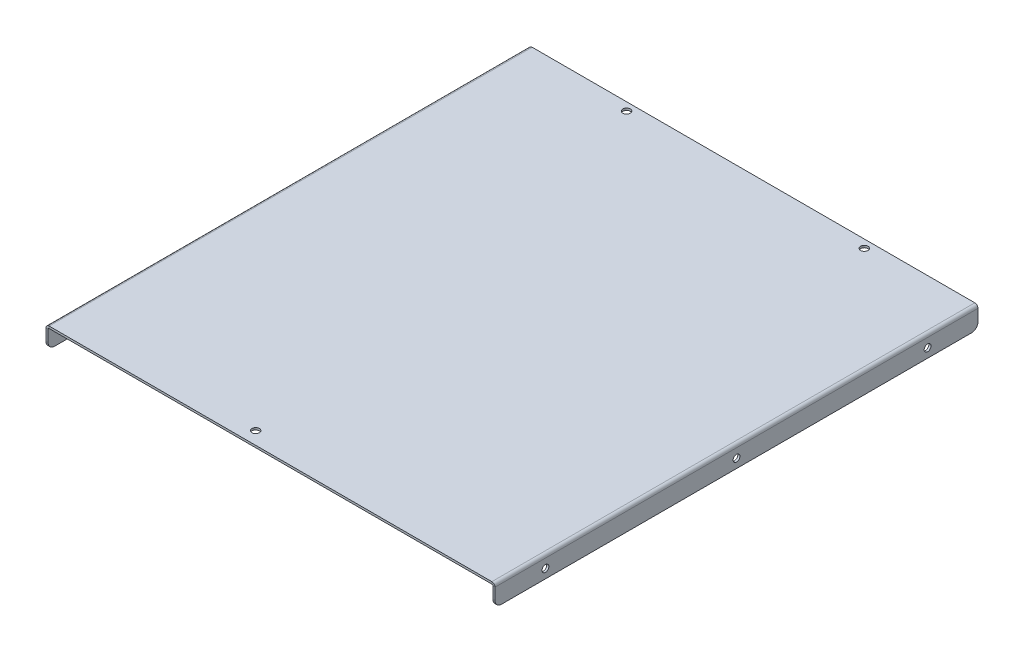
ISO-10303-21;
HEADER;
FILE_DESCRIPTION(('STEP AP214'),'2;1');
FILE_NAME('part.step','',(''),(''),'','','');
FILE_SCHEMA(('AUTOMOTIVE_DESIGN { 1 0 10303 214 1 1 1 1 }'));
ENDSEC;
DATA;
#1=APPLICATION_CONTEXT('core data for automotive mechanical design processes');
#2=APPLICATION_PROTOCOL_DEFINITION('international standard','automotive_design',2000,#1);
#3=PRODUCT_CONTEXT('',#1,'mechanical');
#4=PRODUCT('Part','Part','',(#3));
#5=PRODUCT_RELATED_PRODUCT_CATEGORY('part','',(#4));
#6=PRODUCT_DEFINITION_FORMATION('','',#4);
#7=PRODUCT_DEFINITION_CONTEXT('part definition',#1,'design');
#8=PRODUCT_DEFINITION('design','',#6,#7);
#9=PRODUCT_DEFINITION_SHAPE('','',#8);
#10=(LENGTH_UNIT() NAMED_UNIT(*) SI_UNIT(.MILLI.,.METRE.));
#11=(NAMED_UNIT(*) PLANE_ANGLE_UNIT() SI_UNIT($,.RADIAN.));
#12=(NAMED_UNIT(*) SI_UNIT($,.STERADIAN.) SOLID_ANGLE_UNIT());
#13=UNCERTAINTY_MEASURE_WITH_UNIT(LENGTH_MEASURE(1.E-05),#10,'distance_accuracy_value','');
#14=(GEOMETRIC_REPRESENTATION_CONTEXT(3) GLOBAL_UNCERTAINTY_ASSIGNED_CONTEXT((#13)) GLOBAL_UNIT_ASSIGNED_CONTEXT((#10,
#11,#12)) REPRESENTATION_CONTEXT('',''));
#15=CARTESIAN_POINT('',(0.,0.,0.));
#16=DIRECTION('',(0.,0.,1.));
#17=DIRECTION('',(1.,0.,0.));
#18=AXIS2_PLACEMENT_3D('',#15,#16,#17);
#19=CARTESIAN_POINT('',(0.,-1.,0.));
#20=DIRECTION('',(0.,1.,0.));
#21=DIRECTION('',(0.,0.,1.));
#22=AXIS2_PLACEMENT_3D('',#19,#20,#21);
#23=PLANE('',#22);
#24=CARTESIAN_POINT('',(-13.,-1.,107.75));
#25=DIRECTION('',(0.,1.,0.));
#26=DIRECTION('',(0.,0.,1.));
#27=AXIS2_PLACEMENT_3D('',#24,#25,#26);
#28=CIRCLE('',#27,1.75);
#29=CARTESIAN_POINT('',(-13.,-1.,109.5));
#30=VERTEX_POINT('',#29);
#31=EDGE_CURVE('E911',#30,#30,#28,.T.);
#32=ORIENTED_EDGE('',*,*,#31,.T.);
#33=EDGE_LOOP('',(#32));
#34=FACE_BOUND('',#33,.T.);
#35=CARTESIAN_POINT('',(-55.9999999999999,-1.,-109.950000000001));
#36=DIRECTION('',(0.,1.,0.));
#37=DIRECTION('',(0.,0.,1.));
#38=AXIS2_PLACEMENT_3D('',#35,#36,#37);
#39=CIRCLE('',#38,1.75);
#40=CARTESIAN_POINT('',(-55.9999999999999,-1.,-108.200000000001));
#41=VERTEX_POINT('',#40);
#42=EDGE_CURVE('E928',#41,#41,#39,.T.);
#43=ORIENTED_EDGE('',*,*,#42,.T.);
#44=EDGE_LOOP('',(#43));
#45=FACE_BOUND('',#44,.T.);
#46=CARTESIAN_POINT('',(56.0000000000001,-1.,-109.950000000001));
#47=DIRECTION('',(0.,1.,0.));
#48=DIRECTION('',(0.,0.,1.));
#49=AXIS2_PLACEMENT_3D('',#46,#47,#48);
#50=CIRCLE('',#49,1.75);
#51=CARTESIAN_POINT('',(56.0000000000001,-1.,-108.200000000001));
#52=VERTEX_POINT('',#51);
#53=EDGE_CURVE('E923',#52,#52,#50,.T.);
#54=ORIENTED_EDGE('',*,*,#53,.T.);
#55=EDGE_LOOP('',(#54));
#56=FACE_BOUND('',#55,.T.);
#57=DIRECTION('',(0.,0.,-1.));
#58=VECTOR('',#57,1.);
#59=CARTESIAN_POINT('',(-104.25,-1.00000000000001,-113.75));
#60=LINE('',#59,#58);
#61=CARTESIAN_POINT('',(-104.25,-1.00000000000001,-113.75));
#62=VERTEX_POINT('',#61);
#63=CARTESIAN_POINT('',(-104.25,-1.00000000000001,113.75));
#64=VERTEX_POINT('',#63);
#65=EDGE_CURVE('E295',#62,#64,#60,.F.);
#66=ORIENTED_EDGE('',*,*,#65,.F.);
#67=DIRECTION('',(-1.,0.,0.));
#68=VECTOR('',#67,1.);
#69=CARTESIAN_POINT('',(-105.75,-1.,-113.75));
#70=LINE('',#69,#68);
#71=CARTESIAN_POINT('',(104.25,-1.00000000000001,-113.75));
#72=VERTEX_POINT('',#71);
#73=EDGE_CURVE('E375',#72,#62,#70,.T.);
#74=ORIENTED_EDGE('',*,*,#73,.F.);
#75=DIRECTION('',(0.,0.,1.));
#76=VECTOR('',#75,1.);
#77=CARTESIAN_POINT('',(104.25,-1.00000000000001,113.75));
#78=LINE('',#77,#76);
#79=CARTESIAN_POINT('',(104.25,-1.00000000000001,113.75));
#80=VERTEX_POINT('',#79);
#81=EDGE_CURVE('E361',#80,#72,#78,.F.);
#82=ORIENTED_EDGE('',*,*,#81,.F.);
#83=DIRECTION('',(1.,0.,0.));
#84=VECTOR('',#83,1.);
#85=CARTESIAN_POINT('',(-105.75,-1.,113.75));
#86=LINE('',#85,#84);
#87=EDGE_CURVE('E379',#64,#80,#86,.T.);
#88=ORIENTED_EDGE('',*,*,#87,.F.);
#89=EDGE_LOOP('',(#66,#74,#82,#88));
#90=FACE_BOUND('',#89,.T.);
#91=ADVANCED_FACE('F87',(#34,#45,#56,#90),#23,.F.);
#92=CARTESIAN_POINT('',(0.,0.,0.));
#93=DIRECTION('',(0.,1.,0.));
#94=DIRECTION('',(0.,0.,1.));
#95=AXIS2_PLACEMENT_3D('',#92,#93,#94);
#96=PLANE('',#95);
#97=CARTESIAN_POINT('',(-13.,0.,107.75));
#98=DIRECTION('',(0.,1.,0.));
#99=DIRECTION('',(0.,0.,1.));
#100=AXIS2_PLACEMENT_3D('',#97,#98,#99);
#101=CIRCLE('',#100,1.75);
#102=CARTESIAN_POINT('',(-13.,0.,109.5));
#103=VERTEX_POINT('',#102);
#104=EDGE_CURVE('E909',#103,#103,#101,.T.);
#105=ORIENTED_EDGE('',*,*,#104,.F.);
#106=EDGE_LOOP('',(#105));
#107=FACE_BOUND('',#106,.T.);
#108=CARTESIAN_POINT('',(-55.9999999999999,0.,-109.950000000001));
#109=DIRECTION('',(0.,1.,0.));
#110=DIRECTION('',(0.,0.,1.));
#111=AXIS2_PLACEMENT_3D('',#108,#109,#110);
#112=CIRCLE('',#111,1.75);
#113=CARTESIAN_POINT('',(-55.9999999999999,0.,-108.200000000001));
#114=VERTEX_POINT('',#113);
#115=EDGE_CURVE('E917',#114,#114,#112,.T.);
#116=ORIENTED_EDGE('',*,*,#115,.F.);
#117=EDGE_LOOP('',(#116));
#118=FACE_BOUND('',#117,.T.);
#119=CARTESIAN_POINT('',(56.0000000000001,0.,-109.950000000001));
#120=DIRECTION('',(0.,1.,0.));
#121=DIRECTION('',(0.,0.,1.));
#122=AXIS2_PLACEMENT_3D('',#119,#120,#121);
#123=CIRCLE('',#122,1.75);
#124=CARTESIAN_POINT('',(56.0000000000001,0.,-108.200000000001));
#125=VERTEX_POINT('',#124);
#126=EDGE_CURVE('E913',#125,#125,#123,.T.);
#127=ORIENTED_EDGE('',*,*,#126,.F.);
#128=EDGE_LOOP('',(#127));
#129=FACE_BOUND('',#128,.T.);
#130=DIRECTION('',(-1.,0.,0.));
#131=VECTOR('',#130,1.);
#132=CARTESIAN_POINT('',(-105.75,0.,-113.75));
#133=LINE('',#132,#131);
#134=CARTESIAN_POINT('',(104.25,0.,-113.75));
#135=VERTEX_POINT('',#134);
#136=CARTESIAN_POINT('',(-104.25,0.,-113.75));
#137=VERTEX_POINT('',#136);
#138=EDGE_CURVE('E371',#135,#137,#133,.T.);
#139=ORIENTED_EDGE('',*,*,#138,.T.);
#140=DIRECTION('',(0.,0.,-1.));
#141=VECTOR('',#140,1.);
#142=CARTESIAN_POINT('',(-104.25,0.,-113.75));
#143=LINE('',#142,#141);
#144=CARTESIAN_POINT('',(-104.25,0.,113.75));
#145=VERTEX_POINT('',#144);
#146=EDGE_CURVE('E238',#137,#145,#143,.F.);
#147=ORIENTED_EDGE('',*,*,#146,.T.);
#148=DIRECTION('',(1.,0.,0.));
#149=VECTOR('',#148,1.);
#150=CARTESIAN_POINT('',(-105.75,0.,113.75));
#151=LINE('',#150,#149);
#152=CARTESIAN_POINT('',(104.25,0.,113.75));
#153=VERTEX_POINT('',#152);
#154=EDGE_CURVE('E380',#145,#153,#151,.T.);
#155=ORIENTED_EDGE('',*,*,#154,.T.);
#156=DIRECTION('',(0.,0.,1.));
#157=VECTOR('',#156,1.);
#158=CARTESIAN_POINT('',(104.25,0.,113.75));
#159=LINE('',#158,#157);
#160=EDGE_CURVE('E344',#153,#135,#159,.F.);
#161=ORIENTED_EDGE('',*,*,#160,.T.);
#162=EDGE_LOOP('',(#139,#147,#155,#161));
#163=FACE_BOUND('',#162,.T.);
#164=ADVANCED_FACE('F488',(#107,#118,#129,#163),#96,.T.);
#165=CARTESIAN_POINT('',(-105.75,-1.,-113.75));
#166=DIRECTION('',(0.,0.,-1.));
#167=DIRECTION('',(-1.,0.,0.));
#168=AXIS2_PLACEMENT_3D('',#165,#166,#167);
#169=PLANE('',#168);
#170=ORIENTED_EDGE('',*,*,#73,.T.);
#171=DIRECTION('',(0.,1.,0.));
#172=VECTOR('',#171,1.);
#173=CARTESIAN_POINT('',(-104.25,-1.00000000000001,-113.75));
#174=LINE('',#173,#172);
#175=EDGE_CURVE('E290',#62,#137,#174,.T.);
#176=ORIENTED_EDGE('',*,*,#175,.T.);
#177=ORIENTED_EDGE('',*,*,#138,.F.);
#178=DIRECTION('',(0.,1.,0.));
#179=VECTOR('',#178,1.);
#180=CARTESIAN_POINT('',(104.25,-1.00000000000001,-113.75));
#181=LINE('',#180,#179);
#182=EDGE_CURVE('E367',#72,#135,#181,.T.);
#183=ORIENTED_EDGE('',*,*,#182,.F.);
#184=EDGE_LOOP('',(#170,#176,#177,#183));
#185=FACE_BOUND('',#184,.T.);
#186=ADVANCED_FACE('F486',(#185),#169,.T.);
#187=CARTESIAN_POINT('',(-105.75,-1.,113.75));
#188=DIRECTION('',(0.,0.,1.));
#189=DIRECTION('',(1.,0.,0.));
#190=AXIS2_PLACEMENT_3D('',#187,#188,#189);
#191=PLANE('',#190);
#192=DIRECTION('',(0.,1.,0.));
#193=VECTOR('',#192,1.);
#194=CARTESIAN_POINT('',(-104.25,-1.00000000000001,113.75));
#195=LINE('',#194,#193);
#196=EDGE_CURVE('E300',#64,#145,#195,.T.);
#197=ORIENTED_EDGE('',*,*,#196,.F.);
#198=ORIENTED_EDGE('',*,*,#87,.T.);
#199=DIRECTION('',(0.,1.,0.));
#200=VECTOR('',#199,1.);
#201=CARTESIAN_POINT('',(104.25,-1.00000000000001,113.75));
#202=LINE('',#201,#200);
#203=EDGE_CURVE('E353',#80,#153,#202,.T.);
#204=ORIENTED_EDGE('',*,*,#203,.T.);
#205=ORIENTED_EDGE('',*,*,#154,.F.);
#206=EDGE_LOOP('',(#197,#198,#204,#205));
#207=FACE_BOUND('',#206,.T.);
#208=ADVANCED_FACE('F470',(#207),#191,.T.);
#209=CARTESIAN_POINT('',(104.25,-1.5,-113.75));
#210=DIRECTION('',(0.,0.,-1.));
#211=DIRECTION('',(-1.,0.,0.));
#212=AXIS2_PLACEMENT_3D('',#209,#210,#211);
#213=PLANE('',#212);
#214=DIRECTION('',(-1.,0.,0.));
#215=VECTOR('',#214,1.);
#216=CARTESIAN_POINT('',(105.75,-1.5,-113.75));
#217=LINE('',#216,#215);
#218=CARTESIAN_POINT('',(104.75,-1.49999999999999,-113.75));
#219=VERTEX_POINT('',#218);
#220=CARTESIAN_POINT('',(105.75,-1.49999999999999,-113.75));
#221=VERTEX_POINT('',#220);
#222=EDGE_CURVE('E304',#219,#221,#217,.F.);
#223=ORIENTED_EDGE('',*,*,#222,.F.);
#224=CARTESIAN_POINT('',(104.25,-1.5,-113.75));
#225=DIRECTION('',(0.,0.,1.));
#226=DIRECTION('',(1.,0.,0.));
#227=AXIS2_PLACEMENT_3D('',#224,#225,#226);
#228=CIRCLE('',#227,0.499999999999987);
#229=EDGE_CURVE('E357',#72,#219,#228,.F.);
#230=ORIENTED_EDGE('',*,*,#229,.F.);
#231=ORIENTED_EDGE('',*,*,#182,.T.);
#232=CARTESIAN_POINT('',(104.25,-1.5,-113.75));
#233=DIRECTION('',(0.,0.,1.));
#234=DIRECTION('',(1.,0.,0.));
#235=AXIS2_PLACEMENT_3D('',#232,#233,#234);
#236=CIRCLE('',#235,1.49999999999999);
#237=EDGE_CURVE('E348',#135,#221,#236,.F.);
#238=ORIENTED_EDGE('',*,*,#237,.T.);
#239=EDGE_LOOP('',(#223,#230,#231,#238));
#240=FACE_BOUND('',#239,.T.);
#241=ADVANCED_FACE('F483',(#240),#213,.T.);
#242=CARTESIAN_POINT('',(104.25,-1.5,113.75));
#243=DIRECTION('',(0.,0.,-1.));
#244=DIRECTION('',(-1.,0.,0.));
#245=AXIS2_PLACEMENT_3D('',#242,#243,#244);
#246=PLANE('',#245);
#247=CARTESIAN_POINT('',(104.25,-1.5,113.75));
#248=DIRECTION('',(0.,0.,1.));
#249=DIRECTION('',(1.,0.,0.));
#250=AXIS2_PLACEMENT_3D('',#247,#248,#249);
#251=CIRCLE('',#250,0.499999999999987);
#252=CARTESIAN_POINT('',(104.75,-1.49999999999999,113.75));
#253=VERTEX_POINT('',#252);
#254=EDGE_CURVE('E310',#253,#80,#251,.T.);
#255=ORIENTED_EDGE('',*,*,#254,.F.);
#256=DIRECTION('',(-1.,0.,0.));
#257=VECTOR('',#256,1.);
#258=CARTESIAN_POINT('',(104.75,-1.49999999999999,113.75));
#259=LINE('',#258,#257);
#260=CARTESIAN_POINT('',(105.75,-1.49999999999998,113.75));
#261=VERTEX_POINT('',#260);
#262=EDGE_CURVE('E334',#253,#261,#259,.F.);
#263=ORIENTED_EDGE('',*,*,#262,.T.);
#264=CARTESIAN_POINT('',(104.25,-1.5,113.75));
#265=DIRECTION('',(0.,0.,1.));
#266=DIRECTION('',(1.,0.,0.));
#267=AXIS2_PLACEMENT_3D('',#264,#265,#266);
#268=CIRCLE('',#267,1.49999999999999);
#269=EDGE_CURVE('E349',#261,#153,#268,.T.);
#270=ORIENTED_EDGE('',*,*,#269,.T.);
#271=ORIENTED_EDGE('',*,*,#203,.F.);
#272=EDGE_LOOP('',(#255,#263,#270,#271));
#273=FACE_BOUND('',#272,.T.);
#274=ADVANCED_FACE('F493',(#273),#246,.F.);
#275=CARTESIAN_POINT('',(104.25,-1.5,113.75));
#276=DIRECTION('',(0.,0.,1.));
#277=DIRECTION('',(1.,0.,0.));
#278=AXIS2_PLACEMENT_3D('',#275,#276,#277);
#279=CYLINDRICAL_SURFACE('',#278,1.49999999999999);
#280=ORIENTED_EDGE('',*,*,#160,.F.);
#281=ORIENTED_EDGE('',*,*,#269,.F.);
#282=DIRECTION('',(0.,0.,1.));
#283=VECTOR('',#282,1.);
#284=CARTESIAN_POINT('',(105.75,-1.5,-113.75));
#285=LINE('',#284,#283);
#286=EDGE_CURVE('E330',#261,#221,#285,.F.);
#287=ORIENTED_EDGE('',*,*,#286,.T.);
#288=ORIENTED_EDGE('',*,*,#237,.F.);
#289=EDGE_LOOP('',(#280,#281,#287,#288));
#290=FACE_BOUND('',#289,.T.);
#291=ADVANCED_FACE('F491',(#290),#279,.T.);
#292=CARTESIAN_POINT('',(104.25,-1.5,113.75));
#293=DIRECTION('',(0.,0.,1.));
#294=DIRECTION('',(1.,0.,0.));
#295=AXIS2_PLACEMENT_3D('',#292,#293,#294);
#296=CYLINDRICAL_SURFACE('',#295,0.499999999999987);
#297=ORIENTED_EDGE('',*,*,#81,.T.);
#298=ORIENTED_EDGE('',*,*,#229,.T.);
#299=DIRECTION('',(0.,0.,1.));
#300=VECTOR('',#299,1.);
#301=CARTESIAN_POINT('',(104.75,-1.5,-113.75));
#302=LINE('',#301,#300);
#303=EDGE_CURVE('E338',#219,#253,#302,.T.);
#304=ORIENTED_EDGE('',*,*,#303,.T.);
#305=ORIENTED_EDGE('',*,*,#254,.T.);
#306=EDGE_LOOP('',(#297,#298,#304,#305));
#307=FACE_BOUND('',#306,.T.);
#308=ADVANCED_FACE('F477',(#307),#296,.F.);
#309=CARTESIAN_POINT('',(105.75,-10.,113.75));
#310=DIRECTION('',(0.,0.,-1.));
#311=DIRECTION('',(-1.,0.,0.));
#312=AXIS2_PLACEMENT_3D('',#309,#310,#311);
#313=PLANE('',#312);
#314=DIRECTION('',(0.,1.,0.));
#315=VECTOR('',#314,1.);
#316=CARTESIAN_POINT('',(104.75,-10.,113.75));
#317=LINE('',#316,#315);
#318=CARTESIAN_POINT('',(104.75,-7.00000000000001,113.75));
#319=VERTEX_POINT('',#318);
#320=EDGE_CURVE('E326',#253,#319,#317,.F.);
#321=ORIENTED_EDGE('',*,*,#320,.T.);
#322=DIRECTION('',(-1.,0.,0.));
#323=VECTOR('',#322,1.);
#324=CARTESIAN_POINT('',(105.75,-7.,113.75));
#325=LINE('',#324,#323);
#326=CARTESIAN_POINT('',(105.75,-7.,113.75));
#327=VERTEX_POINT('',#326);
#328=EDGE_CURVE('E422',#319,#327,#325,.F.);
#329=ORIENTED_EDGE('',*,*,#328,.T.);
#330=DIRECTION('',(0.,-1.,0.));
#331=VECTOR('',#330,1.);
#332=CARTESIAN_POINT('',(105.75,3.29619494822483E-13,113.75));
#333=LINE('',#332,#331);
#334=EDGE_CURVE('E315',#261,#327,#333,.T.);
#335=ORIENTED_EDGE('',*,*,#334,.F.);
#336=ORIENTED_EDGE('',*,*,#262,.F.);
#337=EDGE_LOOP('',(#321,#329,#335,#336));
#338=FACE_BOUND('',#337,.T.);
#339=ADVANCED_FACE('F503',(#338),#313,.F.);
#340=CARTESIAN_POINT('',(105.75,-0.999999999999997,-113.75));
#341=DIRECTION('',(0.,0.,1.));
#342=DIRECTION('',(1.,0.,0.));
#343=AXIS2_PLACEMENT_3D('',#340,#341,#342);
#344=PLANE('',#343);
#345=DIRECTION('',(0.,1.,0.));
#346=VECTOR('',#345,1.);
#347=CARTESIAN_POINT('',(105.75,3.29619494822483E-13,-113.75));
#348=LINE('',#347,#346);
#349=CARTESIAN_POINT('',(105.75,-7.,-113.75));
#350=VERTEX_POINT('',#349);
#351=EDGE_CURVE('E307',#350,#221,#348,.T.);
#352=ORIENTED_EDGE('',*,*,#351,.F.);
#353=DIRECTION('',(-1.,0.,0.));
#354=VECTOR('',#353,1.);
#355=CARTESIAN_POINT('',(105.75,-7.,-113.75));
#356=LINE('',#355,#354);
#357=CARTESIAN_POINT('',(104.75,-7.,-113.75));
#358=VERTEX_POINT('',#357);
#359=EDGE_CURVE('E383',#350,#358,#356,.T.);
#360=ORIENTED_EDGE('',*,*,#359,.T.);
#361=DIRECTION('',(0.,-1.,0.));
#362=VECTOR('',#361,1.);
#363=CARTESIAN_POINT('',(104.75,-1.,-113.75));
#364=LINE('',#363,#362);
#365=EDGE_CURVE('E319',#358,#219,#364,.F.);
#366=ORIENTED_EDGE('',*,*,#365,.T.);
#367=ORIENTED_EDGE('',*,*,#222,.T.);
#368=EDGE_LOOP('',(#352,#360,#366,#367));
#369=FACE_BOUND('',#368,.T.);
#370=ADVANCED_FACE('F518',(#369),#344,.F.);
#371=CARTESIAN_POINT('',(105.75,3.29619494822483E-13,0.));
#372=DIRECTION('',(-1.,0.,0.));
#373=DIRECTION('',(0.,-1.,0.));
#374=AXIS2_PLACEMENT_3D('',#371,#372,#373);
#375=PLANE('',#374);
#376=CARTESIAN_POINT('',(105.75,-5.75000000000062,90.));
#377=DIRECTION('',(-1.,0.,0.));
#378=DIRECTION('',(0.,-1.,0.));
#379=AXIS2_PLACEMENT_3D('',#376,#377,#378);
#380=CIRCLE('',#379,1.60000000000001);
#381=CARTESIAN_POINT('',(105.75,-7.35000000000063,90.));
#382=VERTEX_POINT('',#381);
#383=EDGE_CURVE('E394',#382,#382,#380,.T.);
#384=ORIENTED_EDGE('',*,*,#383,.T.);
#385=EDGE_LOOP('',(#384));
#386=FACE_BOUND('',#385,.T.);
#387=CARTESIAN_POINT('',(105.75,-5.75000000000065,0.));
#388=DIRECTION('',(-1.,0.,0.));
#389=DIRECTION('',(0.,-1.,0.));
#390=AXIS2_PLACEMENT_3D('',#387,#388,#389);
#391=CIRCLE('',#390,1.6);
#392=CARTESIAN_POINT('',(105.75,-7.35000000000065,0.));
#393=VERTEX_POINT('',#392);
#394=EDGE_CURVE('E940',#393,#393,#391,.T.);
#395=ORIENTED_EDGE('',*,*,#394,.T.);
#396=EDGE_LOOP('',(#395));
#397=FACE_BOUND('',#396,.T.);
#398=CARTESIAN_POINT('',(105.75,-5.75000000000064,-90.));
#399=DIRECTION('',(-1.,0.,0.));
#400=DIRECTION('',(0.,-1.,0.));
#401=AXIS2_PLACEMENT_3D('',#398,#399,#400);
#402=CIRCLE('',#401,1.60000000000001);
#403=CARTESIAN_POINT('',(105.75,-7.35000000000065,-90.));
#404=VERTEX_POINT('',#403);
#405=EDGE_CURVE('E948',#404,#404,#402,.T.);
#406=ORIENTED_EDGE('',*,*,#405,.T.);
#407=EDGE_LOOP('',(#406));
#408=FACE_BOUND('',#407,.T.);
#409=DIRECTION('',(0.,0.,-1.));
#410=VECTOR('',#409,1.);
#411=CARTESIAN_POINT('',(105.75,-10.,0.));
#412=LINE('',#411,#410);
#413=CARTESIAN_POINT('',(105.75,-10.,110.75));
#414=VERTEX_POINT('',#413);
#415=CARTESIAN_POINT('',(105.75,-10.,-110.75));
#416=VERTEX_POINT('',#415);
#417=EDGE_CURVE('E311',#414,#416,#412,.T.);
#418=ORIENTED_EDGE('',*,*,#417,.T.);
#419=CARTESIAN_POINT('',(105.75,-7.,-110.75));
#420=DIRECTION('',(-1.,0.,0.));
#421=DIRECTION('',(0.,-1.,0.));
#422=AXIS2_PLACEMENT_3D('',#419,#420,#421);
#423=CIRCLE('',#422,3.);
#424=EDGE_CURVE('E420',#416,#350,#423,.F.);
#425=ORIENTED_EDGE('',*,*,#424,.T.);
#426=ORIENTED_EDGE('',*,*,#351,.T.);
#427=ORIENTED_EDGE('',*,*,#286,.F.);
#428=ORIENTED_EDGE('',*,*,#334,.T.);
#429=CARTESIAN_POINT('',(105.75,-7.,110.75));
#430=DIRECTION('',(-1.,0.,0.));
#431=DIRECTION('',(0.,-1.,0.));
#432=AXIS2_PLACEMENT_3D('',#429,#430,#431);
#433=CIRCLE('',#432,3.);
#434=EDGE_CURVE('E417',#327,#414,#433,.F.);
#435=ORIENTED_EDGE('',*,*,#434,.T.);
#436=EDGE_LOOP('',(#418,#425,#426,#427,#428,#435));
#437=FACE_BOUND('',#436,.T.);
#438=ADVANCED_FACE('F500',(#386,#397,#408,#437),#375,.F.);
#439=CARTESIAN_POINT('',(104.75,3.2612801348364E-13,0.));
#440=DIRECTION('',(-1.,0.,0.));
#441=DIRECTION('',(0.,-1.,0.));
#442=AXIS2_PLACEMENT_3D('',#439,#440,#441);
#443=PLANE('',#442);
#444=CARTESIAN_POINT('',(104.75,-5.75000000000062,90.));
#445=DIRECTION('',(-1.,0.,0.));
#446=DIRECTION('',(0.,-1.,0.));
#447=AXIS2_PLACEMENT_3D('',#444,#445,#446);
#448=CIRCLE('',#447,1.60000000000001);
#449=CARTESIAN_POINT('',(104.75,-7.35000000000062,90.));
#450=VERTEX_POINT('',#449);
#451=EDGE_CURVE('E285',#450,#450,#448,.T.);
#452=ORIENTED_EDGE('',*,*,#451,.F.);
#453=EDGE_LOOP('',(#452));
#454=FACE_BOUND('',#453,.T.);
#455=CARTESIAN_POINT('',(104.75,-5.75000000000064,0.));
#456=DIRECTION('',(-1.,0.,0.));
#457=DIRECTION('',(0.,-1.,0.));
#458=AXIS2_PLACEMENT_3D('',#455,#456,#457);
#459=CIRCLE('',#458,1.6);
#460=CARTESIAN_POINT('',(104.75,-7.35000000000064,0.));
#461=VERTEX_POINT('',#460);
#462=EDGE_CURVE('E399',#461,#461,#459,.T.);
#463=ORIENTED_EDGE('',*,*,#462,.F.);
#464=EDGE_LOOP('',(#463));
#465=FACE_BOUND('',#464,.T.);
#466=CARTESIAN_POINT('',(104.75,-5.75000000000064,-90.));
#467=DIRECTION('',(-1.,0.,0.));
#468=DIRECTION('',(0.,-1.,0.));
#469=AXIS2_PLACEMENT_3D('',#466,#467,#468);
#470=CIRCLE('',#469,1.60000000000001);
#471=CARTESIAN_POINT('',(104.75,-7.35000000000065,-90.));
#472=VERTEX_POINT('',#471);
#473=EDGE_CURVE('E393',#472,#472,#470,.T.);
#474=ORIENTED_EDGE('',*,*,#473,.F.);
#475=EDGE_LOOP('',(#474));
#476=FACE_BOUND('',#475,.T.);
#477=ORIENTED_EDGE('',*,*,#365,.F.);
#478=CARTESIAN_POINT('',(104.75,-7.00000000000001,-110.75));
#479=DIRECTION('',(-1.,0.,0.));
#480=DIRECTION('',(0.,-1.,0.));
#481=AXIS2_PLACEMENT_3D('',#478,#479,#480);
#482=CIRCLE('',#481,3.);
#483=CARTESIAN_POINT('',(104.75,-10.,-110.75));
#484=VERTEX_POINT('',#483);
#485=EDGE_CURVE('E409',#358,#484,#482,.T.);
#486=ORIENTED_EDGE('',*,*,#485,.T.);
#487=DIRECTION('',(0.,0.,1.));
#488=VECTOR('',#487,1.);
#489=CARTESIAN_POINT('',(104.75,-10.,-113.75));
#490=LINE('',#489,#488);
#491=CARTESIAN_POINT('',(104.75,-10.,110.75));
#492=VERTEX_POINT('',#491);
#493=EDGE_CURVE('E322',#492,#484,#490,.F.);
#494=ORIENTED_EDGE('',*,*,#493,.F.);
#495=CARTESIAN_POINT('',(104.75,-7.00000000000001,110.75));
#496=DIRECTION('',(-1.,0.,0.));
#497=DIRECTION('',(0.,-1.,0.));
#498=AXIS2_PLACEMENT_3D('',#495,#496,#497);
#499=CIRCLE('',#498,3.);
#500=EDGE_CURVE('E406',#492,#319,#499,.T.);
#501=ORIENTED_EDGE('',*,*,#500,.T.);
#502=ORIENTED_EDGE('',*,*,#320,.F.);
#503=ORIENTED_EDGE('',*,*,#303,.F.);
#504=EDGE_LOOP('',(#477,#486,#494,#501,#502,#503));
#505=FACE_BOUND('',#504,.T.);
#506=ADVANCED_FACE('F521',(#454,#465,#476,#505),#443,.T.);
#507=CARTESIAN_POINT('',(105.75,-10.,-113.75));
#508=DIRECTION('',(0.,1.,0.));
#509=DIRECTION('',(-1.,0.,0.));
#510=AXIS2_PLACEMENT_3D('',#507,#508,#509);
#511=PLANE('',#510);
#512=ORIENTED_EDGE('',*,*,#493,.T.);
#513=DIRECTION('',(-1.,0.,0.));
#514=VECTOR('',#513,1.);
#515=CARTESIAN_POINT('',(105.75,-10.,-110.75));
#516=LINE('',#515,#514);
#517=EDGE_CURVE('E415',#484,#416,#516,.F.);
#518=ORIENTED_EDGE('',*,*,#517,.T.);
#519=ORIENTED_EDGE('',*,*,#417,.F.);
#520=DIRECTION('',(-1.,0.,0.));
#521=VECTOR('',#520,1.);
#522=CARTESIAN_POINT('',(105.75,-10.,110.75));
#523=LINE('',#522,#521);
#524=EDGE_CURVE('E411',#414,#492,#523,.T.);
#525=ORIENTED_EDGE('',*,*,#524,.T.);
#526=EDGE_LOOP('',(#512,#518,#519,#525));
#527=FACE_BOUND('',#526,.T.);
#528=ADVANCED_FACE('F511',(#527),#511,.F.);
#529=CARTESIAN_POINT('',(-104.25,-1.5,113.75));
#530=DIRECTION('',(0.,0.,1.));
#531=DIRECTION('',(1.,0.,0.));
#532=AXIS2_PLACEMENT_3D('',#529,#530,#531);
#533=PLANE('',#532);
#534=DIRECTION('',(1.,0.,0.));
#535=VECTOR('',#534,1.);
#536=CARTESIAN_POINT('',(-105.75,-1.5,113.75));
#537=LINE('',#536,#535);
#538=CARTESIAN_POINT('',(-104.75,-1.49999999999999,113.75));
#539=VERTEX_POINT('',#538);
#540=CARTESIAN_POINT('',(-105.75,-1.49999999999999,113.75));
#541=VERTEX_POINT('',#540);
#542=EDGE_CURVE('E281',#539,#541,#537,.F.);
#543=ORIENTED_EDGE('',*,*,#542,.F.);
#544=CARTESIAN_POINT('',(-104.25,-1.5,113.75));
#545=DIRECTION('',(0.,0.,-1.));
#546=DIRECTION('',(-1.,0.,0.));
#547=AXIS2_PLACEMENT_3D('',#544,#545,#546);
#548=CIRCLE('',#547,0.499999999999987);
#549=EDGE_CURVE('E242',#64,#539,#548,.F.);
#550=ORIENTED_EDGE('',*,*,#549,.F.);
#551=ORIENTED_EDGE('',*,*,#196,.T.);
#552=CARTESIAN_POINT('',(-104.25,-1.5,113.75));
#553=DIRECTION('',(0.,0.,-1.));
#554=DIRECTION('',(-1.,0.,0.));
#555=AXIS2_PLACEMENT_3D('',#552,#553,#554);
#556=CIRCLE('',#555,1.49999999999999);
#557=EDGE_CURVE('E288',#145,#541,#556,.F.);
#558=ORIENTED_EDGE('',*,*,#557,.T.);
#559=EDGE_LOOP('',(#543,#550,#551,#558));
#560=FACE_BOUND('',#559,.T.);
#561=ADVANCED_FACE('F466',(#560),#533,.T.);
#562=CARTESIAN_POINT('',(-104.25,-1.5,-113.75));
#563=DIRECTION('',(0.,0.,1.));
#564=DIRECTION('',(1.,0.,0.));
#565=AXIS2_PLACEMENT_3D('',#562,#563,#564);
#566=PLANE('',#565);
#567=CARTESIAN_POINT('',(-104.25,-1.5,-113.75));
#568=DIRECTION('',(0.,0.,-1.));
#569=DIRECTION('',(-1.,0.,0.));
#570=AXIS2_PLACEMENT_3D('',#567,#568,#569);
#571=CIRCLE('',#570,0.499999999999987);
#572=CARTESIAN_POINT('',(-104.75,-1.49999999999999,-113.75));
#573=VERTEX_POINT('',#572);
#574=EDGE_CURVE('E249',#573,#62,#571,.T.);
#575=ORIENTED_EDGE('',*,*,#574,.F.);
#576=DIRECTION('',(1.,0.,0.));
#577=VECTOR('',#576,1.);
#578=CARTESIAN_POINT('',(-104.75,-1.49999999999999,-113.75));
#579=LINE('',#578,#577);
#580=CARTESIAN_POINT('',(-105.75,-1.49999999999998,-113.75));
#581=VERTEX_POINT('',#580);
#582=EDGE_CURVE('E246',#573,#581,#579,.F.);
#583=ORIENTED_EDGE('',*,*,#582,.T.);
#584=CARTESIAN_POINT('',(-104.25,-1.5,-113.75));
#585=DIRECTION('',(0.,0.,-1.));
#586=DIRECTION('',(-1.,0.,0.));
#587=AXIS2_PLACEMENT_3D('',#584,#585,#586);
#588=CIRCLE('',#587,1.49999999999999);
#589=EDGE_CURVE('E231',#581,#137,#588,.T.);
#590=ORIENTED_EDGE('',*,*,#589,.T.);
#591=ORIENTED_EDGE('',*,*,#175,.F.);
#592=EDGE_LOOP('',(#575,#583,#590,#591));
#593=FACE_BOUND('',#592,.T.);
#594=ADVANCED_FACE('F247',(#593),#566,.F.);
#595=CARTESIAN_POINT('',(-104.25,-1.5,-113.75));
#596=DIRECTION('',(0.,0.,-1.));
#597=DIRECTION('',(-1.,0.,0.));
#598=AXIS2_PLACEMENT_3D('',#595,#596,#597);
#599=CYLINDRICAL_SURFACE('',#598,1.49999999999999);
#600=ORIENTED_EDGE('',*,*,#146,.F.);
#601=ORIENTED_EDGE('',*,*,#589,.F.);
#602=DIRECTION('',(0.,0.,-1.));
#603=VECTOR('',#602,1.);
#604=CARTESIAN_POINT('',(-105.75,-1.5,113.75));
#605=LINE('',#604,#603);
#606=EDGE_CURVE('E235',#581,#541,#605,.F.);
#607=ORIENTED_EDGE('',*,*,#606,.T.);
#608=ORIENTED_EDGE('',*,*,#557,.F.);
#609=EDGE_LOOP('',(#600,#601,#607,#608));
#610=FACE_BOUND('',#609,.T.);
#611=ADVANCED_FACE('F233',(#610),#599,.T.);
#612=CARTESIAN_POINT('',(-104.25,-1.5,-113.75));
#613=DIRECTION('',(0.,0.,-1.));
#614=DIRECTION('',(-1.,0.,0.));
#615=AXIS2_PLACEMENT_3D('',#612,#613,#614);
#616=CYLINDRICAL_SURFACE('',#615,0.499999999999987);
#617=ORIENTED_EDGE('',*,*,#65,.T.);
#618=ORIENTED_EDGE('',*,*,#549,.T.);
#619=DIRECTION('',(0.,0.,-1.));
#620=VECTOR('',#619,1.);
#621=CARTESIAN_POINT('',(-104.75,-1.5,113.75));
#622=LINE('',#621,#620);
#623=EDGE_CURVE('E252',#539,#573,#622,.T.);
#624=ORIENTED_EDGE('',*,*,#623,.T.);
#625=ORIENTED_EDGE('',*,*,#574,.T.);
#626=EDGE_LOOP('',(#617,#618,#624,#625));
#627=FACE_BOUND('',#626,.T.);
#628=ADVANCED_FACE('F461',(#627),#616,.F.);
#629=CARTESIAN_POINT('',(-105.75,-10.,-113.75));
#630=DIRECTION('',(0.,0.,1.));
#631=DIRECTION('',(1.,0.,0.));
#632=AXIS2_PLACEMENT_3D('',#629,#630,#631);
#633=PLANE('',#632);
#634=DIRECTION('',(0.,1.,0.));
#635=VECTOR('',#634,1.);
#636=CARTESIAN_POINT('',(-104.75,-10.,-113.75));
#637=LINE('',#636,#635);
#638=CARTESIAN_POINT('',(-104.75,-7.00000000000001,-113.75));
#639=VERTEX_POINT('',#638);
#640=EDGE_CURVE('E261',#573,#639,#637,.F.);
#641=ORIENTED_EDGE('',*,*,#640,.T.);
#642=DIRECTION('',(1.,0.,0.));
#643=VECTOR('',#642,1.);
#644=CARTESIAN_POINT('',(-105.75,-7.,-113.75));
#645=LINE('',#644,#643);
#646=CARTESIAN_POINT('',(-105.75,-7.,-113.75));
#647=VERTEX_POINT('',#646);
#648=EDGE_CURVE('E13',#639,#647,#645,.F.);
#649=ORIENTED_EDGE('',*,*,#648,.T.);
#650=DIRECTION('',(0.,-1.,0.));
#651=VECTOR('',#650,1.);
#652=CARTESIAN_POINT('',(-105.75,3.29619494822483E-13,-113.75));
#653=LINE('',#652,#651);
#654=EDGE_CURVE('E256',#581,#647,#653,.T.);
#655=ORIENTED_EDGE('',*,*,#654,.F.);
#656=ORIENTED_EDGE('',*,*,#582,.F.);
#657=EDGE_LOOP('',(#641,#649,#655,#656));
#658=FACE_BOUND('',#657,.T.);
#659=ADVANCED_FACE('F263',(#658),#633,.F.);
#660=CARTESIAN_POINT('',(-105.75,-0.999999999999997,113.75));
#661=DIRECTION('',(0.,0.,-1.));
#662=DIRECTION('',(-1.,0.,0.));
#663=AXIS2_PLACEMENT_3D('',#660,#661,#662);
#664=PLANE('',#663);
#665=DIRECTION('',(0.,1.,0.));
#666=VECTOR('',#665,1.);
#667=CARTESIAN_POINT('',(-105.75,3.29619494822483E-13,113.75));
#668=LINE('',#667,#666);
#669=CARTESIAN_POINT('',(-105.75,-7.,113.75));
#670=VERTEX_POINT('',#669);
#671=EDGE_CURVE('E259',#670,#541,#668,.T.);
#672=ORIENTED_EDGE('',*,*,#671,.F.);
#673=DIRECTION('',(1.,0.,0.));
#674=VECTOR('',#673,1.);
#675=CARTESIAN_POINT('',(-105.75,-7.,113.75));
#676=LINE('',#675,#674);
#677=CARTESIAN_POINT('',(-104.75,-7.,113.75));
#678=VERTEX_POINT('',#677);
#679=EDGE_CURVE('E425',#670,#678,#676,.T.);
#680=ORIENTED_EDGE('',*,*,#679,.T.);
#681=DIRECTION('',(0.,-1.,0.));
#682=VECTOR('',#681,1.);
#683=CARTESIAN_POINT('',(-104.75,-1.,113.75));
#684=LINE('',#683,#682);
#685=EDGE_CURVE('E266',#678,#539,#684,.F.);
#686=ORIENTED_EDGE('',*,*,#685,.T.);
#687=ORIENTED_EDGE('',*,*,#542,.T.);
#688=EDGE_LOOP('',(#672,#680,#686,#687));
#689=FACE_BOUND('',#688,.T.);
#690=ADVANCED_FACE('F448',(#689),#664,.F.);
#691=CARTESIAN_POINT('',(-105.75,3.29619494822483E-13,0.));
#692=DIRECTION('',(1.,0.,0.));
#693=DIRECTION('',(0.,1.,0.));
#694=AXIS2_PLACEMENT_3D('',#691,#692,#693);
#695=PLANE('',#694);
#696=CARTESIAN_POINT('',(-105.75,-5.74999999999997,90.));
#697=DIRECTION('',(-1.,0.,0.));
#698=DIRECTION('',(0.,-1.,0.));
#699=AXIS2_PLACEMENT_3D('',#696,#697,#698);
#700=CIRCLE('',#699,1.60000000000001);
#701=CARTESIAN_POINT('',(-105.75,-7.34999999999998,90.));
#702=VERTEX_POINT('',#701);
#703=EDGE_CURVE('E936',#702,#702,#700,.T.);
#704=ORIENTED_EDGE('',*,*,#703,.F.);
#705=EDGE_LOOP('',(#704));
#706=FACE_BOUND('',#705,.T.);
#707=CARTESIAN_POINT('',(-105.75,-5.74999999999999,0.));
#708=DIRECTION('',(-1.,0.,0.));
#709=DIRECTION('',(0.,-1.,0.));
#710=AXIS2_PLACEMENT_3D('',#707,#708,#709);
#711=CIRCLE('',#710,1.6);
#712=CARTESIAN_POINT('',(-105.75,-7.34999999999999,0.));
#713=VERTEX_POINT('',#712);
#714=EDGE_CURVE('E944',#713,#713,#711,.T.);
#715=ORIENTED_EDGE('',*,*,#714,.F.);
#716=EDGE_LOOP('',(#715));
#717=FACE_BOUND('',#716,.T.);
#718=CARTESIAN_POINT('',(-105.75,-5.74999999999999,-90.));
#719=DIRECTION('',(-1.,0.,0.));
#720=DIRECTION('',(0.,-1.,0.));
#721=AXIS2_PLACEMENT_3D('',#718,#719,#720);
#722=CIRCLE('',#721,1.60000000000001);
#723=CARTESIAN_POINT('',(-105.75,-7.35,-90.));
#724=VERTEX_POINT('',#723);
#725=EDGE_CURVE('E932',#724,#724,#722,.T.);
#726=ORIENTED_EDGE('',*,*,#725,.F.);
#727=EDGE_LOOP('',(#726));
#728=FACE_BOUND('',#727,.T.);
#729=DIRECTION('',(0.,0.,1.));
#730=VECTOR('',#729,1.);
#731=CARTESIAN_POINT('',(-105.75,-10.,0.));
#732=LINE('',#731,#730);
#733=CARTESIAN_POINT('',(-105.75,-10.,-110.75));
#734=VERTEX_POINT('',#733);
#735=CARTESIAN_POINT('',(-105.75,-10.,110.75));
#736=VERTEX_POINT('',#735);
#737=EDGE_CURVE('E265',#734,#736,#732,.T.);
#738=ORIENTED_EDGE('',*,*,#737,.T.);
#739=CARTESIAN_POINT('',(-105.75,-7.,110.75));
#740=DIRECTION('',(1.,0.,0.));
#741=DIRECTION('',(0.,1.,0.));
#742=AXIS2_PLACEMENT_3D('',#739,#740,#741);
#743=CIRCLE('',#742,3.);
#744=EDGE_CURVE('E96',#736,#670,#743,.F.);
#745=ORIENTED_EDGE('',*,*,#744,.T.);
#746=ORIENTED_EDGE('',*,*,#671,.T.);
#747=ORIENTED_EDGE('',*,*,#606,.F.);
#748=ORIENTED_EDGE('',*,*,#654,.T.);
#749=CARTESIAN_POINT('',(-105.75,-7.,-110.75));
#750=DIRECTION('',(1.,0.,0.));
#751=DIRECTION('',(0.,1.,0.));
#752=AXIS2_PLACEMENT_3D('',#749,#750,#751);
#753=CIRCLE('',#752,3.);
#754=EDGE_CURVE('E441',#647,#734,#753,.F.);
#755=ORIENTED_EDGE('',*,*,#754,.T.);
#756=EDGE_LOOP('',(#738,#745,#746,#747,#748,#755));
#757=FACE_BOUND('',#756,.T.);
#758=ADVANCED_FACE('F255',(#706,#717,#728,#757),#695,.F.);
#759=CARTESIAN_POINT('',(-104.75,3.2612801348364E-13,0.));
#760=DIRECTION('',(1.,0.,0.));
#761=DIRECTION('',(0.,1.,0.));
#762=AXIS2_PLACEMENT_3D('',#759,#760,#761);
#763=PLANE('',#762);
#764=CARTESIAN_POINT('',(-104.75,-5.74999999999998,90.));
#765=DIRECTION('',(1.,0.,0.));
#766=DIRECTION('',(0.,1.,0.));
#767=AXIS2_PLACEMENT_3D('',#764,#765,#766);
#768=CIRCLE('',#767,1.60000000000001);
#769=CARTESIAN_POINT('',(-104.75,-4.14999999999997,90.));
#770=VERTEX_POINT('',#769);
#771=EDGE_CURVE('E400',#770,#770,#768,.T.);
#772=ORIENTED_EDGE('',*,*,#771,.F.);
#773=EDGE_LOOP('',(#772));
#774=FACE_BOUND('',#773,.T.);
#775=CARTESIAN_POINT('',(-104.75,-5.75,0.));
#776=DIRECTION('',(1.,0.,0.));
#777=DIRECTION('',(0.,1.,0.));
#778=AXIS2_PLACEMENT_3D('',#775,#776,#777);
#779=CIRCLE('',#778,1.6);
#780=CARTESIAN_POINT('',(-104.75,-4.15,0.));
#781=VERTEX_POINT('',#780);
#782=EDGE_CURVE('E395',#781,#781,#779,.T.);
#783=ORIENTED_EDGE('',*,*,#782,.F.);
#784=EDGE_LOOP('',(#783));
#785=FACE_BOUND('',#784,.T.);
#786=CARTESIAN_POINT('',(-104.75,-5.75,-90.));
#787=DIRECTION('',(1.,0.,0.));
#788=DIRECTION('',(0.,1.,0.));
#789=AXIS2_PLACEMENT_3D('',#786,#787,#788);
#790=CIRCLE('',#789,1.60000000000001);
#791=CARTESIAN_POINT('',(-104.75,-4.14999999999999,-90.));
#792=VERTEX_POINT('',#791);
#793=EDGE_CURVE('E389',#792,#792,#790,.T.);
#794=ORIENTED_EDGE('',*,*,#793,.F.);
#795=EDGE_LOOP('',(#794));
#796=FACE_BOUND('',#795,.T.);
#797=ORIENTED_EDGE('',*,*,#685,.F.);
#798=CARTESIAN_POINT('',(-104.75,-7.00000000000001,110.75));
#799=DIRECTION('',(1.,0.,0.));
#800=DIRECTION('',(0.,1.,0.));
#801=AXIS2_PLACEMENT_3D('',#798,#799,#800);
#802=CIRCLE('',#801,3.);
#803=CARTESIAN_POINT('',(-104.75,-10.,110.75));
#804=VERTEX_POINT('',#803);
#805=EDGE_CURVE('E432',#678,#804,#802,.T.);
#806=ORIENTED_EDGE('',*,*,#805,.T.);
#807=DIRECTION('',(0.,0.,-1.));
#808=VECTOR('',#807,1.);
#809=CARTESIAN_POINT('',(-104.75,-10.,113.75));
#810=LINE('',#809,#808);
#811=CARTESIAN_POINT('',(-104.75,-10.,-110.75));
#812=VERTEX_POINT('',#811);
#813=EDGE_CURVE('E271',#812,#804,#810,.F.);
#814=ORIENTED_EDGE('',*,*,#813,.F.);
#815=CARTESIAN_POINT('',(-104.75,-7.00000000000001,-110.75));
#816=DIRECTION('',(1.,0.,0.));
#817=DIRECTION('',(0.,1.,0.));
#818=AXIS2_PLACEMENT_3D('',#815,#816,#817);
#819=CIRCLE('',#818,3.);
#820=EDGE_CURVE('E429',#812,#639,#819,.T.);
#821=ORIENTED_EDGE('',*,*,#820,.T.);
#822=ORIENTED_EDGE('',*,*,#640,.F.);
#823=ORIENTED_EDGE('',*,*,#623,.F.);
#824=EDGE_LOOP('',(#797,#806,#814,#821,#822,#823));
#825=FACE_BOUND('',#824,.T.);
#826=ADVANCED_FACE('F455',(#774,#785,#796,#825),#763,.T.);
#827=CARTESIAN_POINT('',(-105.75,-10.,113.75));
#828=DIRECTION('',(0.,1.,0.));
#829=DIRECTION('',(-1.,0.,0.));
#830=AXIS2_PLACEMENT_3D('',#827,#828,#829);
#831=PLANE('',#830);
#832=ORIENTED_EDGE('',*,*,#813,.T.);
#833=DIRECTION('',(1.,0.,0.));
#834=VECTOR('',#833,1.);
#835=CARTESIAN_POINT('',(-105.75,-10.,110.75));
#836=LINE('',#835,#834);
#837=EDGE_CURVE('E115',#804,#736,#836,.F.);
#838=ORIENTED_EDGE('',*,*,#837,.T.);
#839=ORIENTED_EDGE('',*,*,#737,.F.);
#840=DIRECTION('',(1.,0.,0.));
#841=VECTOR('',#840,1.);
#842=CARTESIAN_POINT('',(-105.75,-10.,-110.75));
#843=LINE('',#842,#841);
#844=EDGE_CURVE('E435',#734,#812,#843,.T.);
#845=ORIENTED_EDGE('',*,*,#844,.T.);
#846=EDGE_LOOP('',(#832,#838,#839,#845));
#847=FACE_BOUND('',#846,.T.);
#848=ADVANCED_FACE('F457',(#847),#831,.F.);
#849=CARTESIAN_POINT('',(105.75,-5.75000000000064,-90.));
#850=DIRECTION('',(-1.,0.,0.));
#851=DIRECTION('',(0.,-1.,0.));
#852=AXIS2_PLACEMENT_3D('',#849,#850,#851);
#853=CYLINDRICAL_SURFACE('',#852,1.60000000000001);
#854=ORIENTED_EDGE('',*,*,#793,.T.);
#855=EDGE_LOOP('',(#854));
#856=FACE_BOUND('',#855,.T.);
#857=ORIENTED_EDGE('',*,*,#725,.T.);
#858=EDGE_LOOP('',(#857));
#859=FACE_BOUND('',#858,.T.);
#860=ADVANCED_FACE('F585',(#856,#859),#853,.F.);
#861=CARTESIAN_POINT('',(105.75,-5.75000000000065,0.));
#862=DIRECTION('',(-1.,0.,0.));
#863=DIRECTION('',(0.,-1.,0.));
#864=AXIS2_PLACEMENT_3D('',#861,#862,#863);
#865=CYLINDRICAL_SURFACE('',#864,1.6);
#866=ORIENTED_EDGE('',*,*,#782,.T.);
#867=EDGE_LOOP('',(#866));
#868=FACE_BOUND('',#867,.T.);
#869=ORIENTED_EDGE('',*,*,#714,.T.);
#870=EDGE_LOOP('',(#869));
#871=FACE_BOUND('',#870,.T.);
#872=ADVANCED_FACE('F581',(#868,#871),#865,.F.);
#873=CARTESIAN_POINT('',(105.75,-5.75000000000062,90.));
#874=DIRECTION('',(-1.,0.,0.));
#875=DIRECTION('',(0.,-1.,0.));
#876=AXIS2_PLACEMENT_3D('',#873,#874,#875);
#877=CYLINDRICAL_SURFACE('',#876,1.60000000000001);
#878=ORIENTED_EDGE('',*,*,#771,.T.);
#879=EDGE_LOOP('',(#878));
#880=FACE_BOUND('',#879,.T.);
#881=ORIENTED_EDGE('',*,*,#703,.T.);
#882=EDGE_LOOP('',(#881));
#883=FACE_BOUND('',#882,.T.);
#884=ADVANCED_FACE('F577',(#880,#883),#877,.F.);
#885=ORIENTED_EDGE('',*,*,#473,.T.);
#886=EDGE_LOOP('',(#885));
#887=FACE_BOUND('',#886,.T.);
#888=ORIENTED_EDGE('',*,*,#405,.F.);
#889=EDGE_LOOP('',(#888));
#890=FACE_BOUND('',#889,.T.);
#891=ADVANCED_FACE('F580',(#887,#890),#853,.F.);
#892=ORIENTED_EDGE('',*,*,#462,.T.);
#893=EDGE_LOOP('',(#892));
#894=FACE_BOUND('',#893,.T.);
#895=ORIENTED_EDGE('',*,*,#394,.F.);
#896=EDGE_LOOP('',(#895));
#897=FACE_BOUND('',#896,.T.);
#898=ADVANCED_FACE('F587',(#894,#897),#865,.F.);
#899=ORIENTED_EDGE('',*,*,#451,.T.);
#900=EDGE_LOOP('',(#899));
#901=FACE_BOUND('',#900,.T.);
#902=ORIENTED_EDGE('',*,*,#383,.F.);
#903=EDGE_LOOP('',(#902));
#904=FACE_BOUND('',#903,.T.);
#905=ADVANCED_FACE('F554',(#901,#904),#877,.F.);
#906=CARTESIAN_POINT('',(105.75,-7.,-110.75));
#907=DIRECTION('',(-1.,0.,0.));
#908=DIRECTION('',(0.,-1.,0.));
#909=AXIS2_PLACEMENT_3D('',#906,#907,#908);
#910=CYLINDRICAL_SURFACE('',#909,3.);
#911=ORIENTED_EDGE('',*,*,#424,.F.);
#912=ORIENTED_EDGE('',*,*,#517,.F.);
#913=ORIENTED_EDGE('',*,*,#485,.F.);
#914=ORIENTED_EDGE('',*,*,#359,.F.);
#915=EDGE_LOOP('',(#911,#912,#913,#914));
#916=FACE_BOUND('',#915,.T.);
#917=ADVANCED_FACE('F515',(#916),#910,.T.);
#918=CARTESIAN_POINT('',(105.75,-7.,110.75));
#919=DIRECTION('',(-1.,0.,0.));
#920=DIRECTION('',(0.,-1.,0.));
#921=AXIS2_PLACEMENT_3D('',#918,#919,#920);
#922=CYLINDRICAL_SURFACE('',#921,3.);
#923=ORIENTED_EDGE('',*,*,#434,.F.);
#924=ORIENTED_EDGE('',*,*,#328,.F.);
#925=ORIENTED_EDGE('',*,*,#500,.F.);
#926=ORIENTED_EDGE('',*,*,#524,.F.);
#927=EDGE_LOOP('',(#923,#924,#925,#926));
#928=FACE_BOUND('',#927,.T.);
#929=ADVANCED_FACE('F506',(#928),#922,.T.);
#930=CARTESIAN_POINT('',(-105.75,-7.,110.75));
#931=DIRECTION('',(1.,0.,0.));
#932=DIRECTION('',(0.,1.,0.));
#933=AXIS2_PLACEMENT_3D('',#930,#931,#932);
#934=CYLINDRICAL_SURFACE('',#933,3.);
#935=ORIENTED_EDGE('',*,*,#744,.F.);
#936=ORIENTED_EDGE('',*,*,#837,.F.);
#937=ORIENTED_EDGE('',*,*,#805,.F.);
#938=ORIENTED_EDGE('',*,*,#679,.F.);
#939=EDGE_LOOP('',(#935,#936,#937,#938));
#940=FACE_BOUND('',#939,.T.);
#941=ADVANCED_FACE('F452',(#940),#934,.T.);
#942=CARTESIAN_POINT('',(-105.75,-7.,-110.75));
#943=DIRECTION('',(1.,0.,0.));
#944=DIRECTION('',(0.,1.,0.));
#945=AXIS2_PLACEMENT_3D('',#942,#943,#944);
#946=CYLINDRICAL_SURFACE('',#945,3.);
#947=ORIENTED_EDGE('',*,*,#754,.F.);
#948=ORIENTED_EDGE('',*,*,#648,.F.);
#949=ORIENTED_EDGE('',*,*,#820,.F.);
#950=ORIENTED_EDGE('',*,*,#844,.F.);
#951=EDGE_LOOP('',(#947,#948,#949,#950));
#952=FACE_BOUND('',#951,.T.);
#953=ADVANCED_FACE('F89',(#952),#946,.T.);
#954=CARTESIAN_POINT('',(56.0000000000001,-10.,-109.950000000001));
#955=DIRECTION('',(0.,1.,0.));
#956=DIRECTION('',(0.,0.,1.));
#957=AXIS2_PLACEMENT_3D('',#954,#955,#956);
#958=CYLINDRICAL_SURFACE('',#957,1.75);
#959=ORIENTED_EDGE('',*,*,#126,.T.);
#960=EDGE_LOOP('',(#959));
#961=FACE_BOUND('',#960,.T.);
#962=ORIENTED_EDGE('',*,*,#53,.F.);
#963=EDGE_LOOP('',(#962));
#964=FACE_BOUND('',#963,.T.);
#965=ADVANCED_FACE('F560',(#961,#964),#958,.F.);
#966=CARTESIAN_POINT('',(-55.9999999999999,-10.,-109.950000000001));
#967=DIRECTION('',(0.,1.,0.));
#968=DIRECTION('',(0.,0.,1.));
#969=AXIS2_PLACEMENT_3D('',#966,#967,#968);
#970=CYLINDRICAL_SURFACE('',#969,1.75);
#971=ORIENTED_EDGE('',*,*,#115,.T.);
#972=EDGE_LOOP('',(#971));
#973=FACE_BOUND('',#972,.T.);
#974=ORIENTED_EDGE('',*,*,#42,.F.);
#975=EDGE_LOOP('',(#974));
#976=FACE_BOUND('',#975,.T.);
#977=ADVANCED_FACE('F564',(#973,#976),#970,.F.);
#978=CARTESIAN_POINT('',(-13.,-10.,107.75));
#979=DIRECTION('',(0.,1.,0.));
#980=DIRECTION('',(0.,0.,1.));
#981=AXIS2_PLACEMENT_3D('',#978,#979,#980);
#982=CYLINDRICAL_SURFACE('',#981,1.75);
#983=ORIENTED_EDGE('',*,*,#104,.T.);
#984=EDGE_LOOP('',(#983));
#985=FACE_BOUND('',#984,.T.);
#986=ORIENTED_EDGE('',*,*,#31,.F.);
#987=EDGE_LOOP('',(#986));
#988=FACE_BOUND('',#987,.T.);
#989=ADVANCED_FACE('F570',(#985,#988),#982,.F.);
#990=CLOSED_SHELL('',(#91,#164,#186,#208,#241,#274,#291,#308,#339,#370,#438,#506,#528,#561,#594,
#611,#628,#659,#690,#758,#826,#848,#860,#872,#884,#891,#898,#905,#917,#929,#941,#953,#965,#977,#989));
#991=MANIFOLD_SOLID_BREP('B2',#990);
#992=ADVANCED_BREP_SHAPE_REPRESENTATION('',(#18,#991),#14);
#993=SHAPE_DEFINITION_REPRESENTATION(#9,#992);
ENDSEC;
END-ISO-10303-21;
